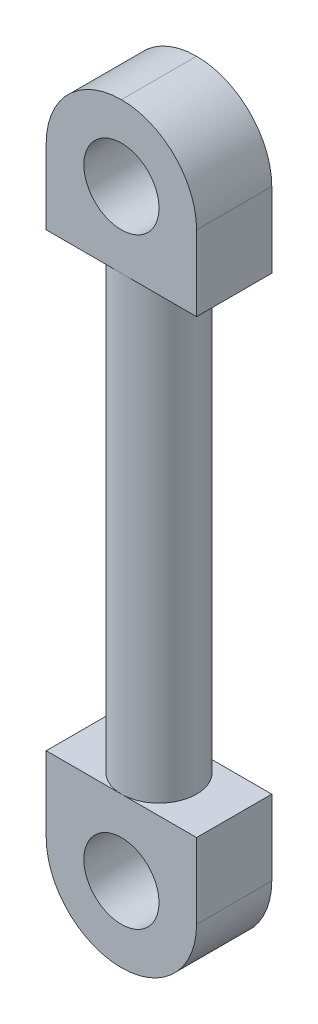
ISO-10303-21;
HEADER;
FILE_DESCRIPTION(('STEP AP214'),'2;1');
FILE_NAME('part.step','',(''),(''),'','','');
FILE_SCHEMA(('AUTOMOTIVE_DESIGN { 1 0 10303 214 1 1 1 1 }'));
ENDSEC;
DATA;
#1=APPLICATION_CONTEXT('core data for automotive mechanical design processes');
#2=APPLICATION_PROTOCOL_DEFINITION('international standard','automotive_design',2000,#1);
#3=PRODUCT_CONTEXT('',#1,'mechanical');
#4=PRODUCT('Part','Part','',(#3));
#5=PRODUCT_RELATED_PRODUCT_CATEGORY('part','',(#4));
#6=PRODUCT_DEFINITION_FORMATION('','',#4);
#7=PRODUCT_DEFINITION_CONTEXT('part definition',#1,'design');
#8=PRODUCT_DEFINITION('design','',#6,#7);
#9=PRODUCT_DEFINITION_SHAPE('','',#8);
#10=(LENGTH_UNIT() NAMED_UNIT(*) SI_UNIT(.MILLI.,.METRE.));
#11=(NAMED_UNIT(*) PLANE_ANGLE_UNIT() SI_UNIT($,.RADIAN.));
#12=(NAMED_UNIT(*) SI_UNIT($,.STERADIAN.) SOLID_ANGLE_UNIT());
#13=UNCERTAINTY_MEASURE_WITH_UNIT(LENGTH_MEASURE(1.E-05),#10,'distance_accuracy_value','');
#14=(GEOMETRIC_REPRESENTATION_CONTEXT(3) GLOBAL_UNCERTAINTY_ASSIGNED_CONTEXT((#13)) GLOBAL_UNIT_ASSIGNED_CONTEXT((#10,
#11,#12)) REPRESENTATION_CONTEXT('',''));
#15=CARTESIAN_POINT('',(0.,0.,0.));
#16=DIRECTION('',(0.,0.,1.));
#17=DIRECTION('',(1.,0.,0.));
#18=AXIS2_PLACEMENT_3D('',#15,#16,#17);
#19=CARTESIAN_POINT('',(0.,9.525,0.));
#20=DIRECTION('',(0.,-1.,0.));
#21=DIRECTION('',(0.,0.,-1.));
#22=AXIS2_PLACEMENT_3D('',#19,#20,#21);
#23=CYLINDRICAL_SURFACE('',#22,1.5875);
#24=CARTESIAN_POINT('',(0.,9.525,0.));
#25=DIRECTION('',(0.,1.,0.));
#26=DIRECTION('',(0.,0.,1.));
#27=AXIS2_PLACEMENT_3D('',#24,#25,#26);
#28=CIRCLE('',#27,1.5875);
#29=CARTESIAN_POINT('',(0.,9.525,1.5875));
#30=VERTEX_POINT('',#29);
#31=CARTESIAN_POINT('',(0.,9.525,-1.5875));
#32=VERTEX_POINT('',#31);
#33=EDGE_CURVE('E196',#30,#32,#28,.T.);
#34=ORIENTED_EDGE('',*,*,#33,.F.);
#35=EDGE_CURVE('E195',#32,#30,#28,.T.);
#36=ORIENTED_EDGE('',*,*,#35,.F.);
#37=EDGE_LOOP('',(#34,#36));
#38=FACE_BOUND('',#37,.T.);
#39=CARTESIAN_POINT('',(0.,-9.525,0.));
#40=DIRECTION('',(0.,1.,0.));
#41=DIRECTION('',(0.,0.,1.));
#42=AXIS2_PLACEMENT_3D('',#39,#40,#41);
#43=CIRCLE('',#42,1.5875);
#44=CARTESIAN_POINT('',(0.,-9.525,1.5875));
#45=VERTEX_POINT('',#44);
#46=CARTESIAN_POINT('',(0.,-9.525,-1.5875));
#47=VERTEX_POINT('',#46);
#48=EDGE_CURVE('E142',#45,#47,#43,.T.);
#49=ORIENTED_EDGE('',*,*,#48,.T.);
#50=EDGE_CURVE('E132',#47,#45,#43,.T.);
#51=ORIENTED_EDGE('',*,*,#50,.T.);
#52=EDGE_LOOP('',(#49,#51));
#53=FACE_BOUND('',#52,.T.);
#54=ADVANCED_FACE('F33',(#38,#53),#23,.T.);
#55=CARTESIAN_POINT('',(0.,9.525,0.));
#56=DIRECTION('',(0.,-1.,0.));
#57=DIRECTION('',(0.,0.,-1.));
#58=AXIS2_PLACEMENT_3D('',#55,#56,#57);
#59=PLANE('',#58);
#60=DIRECTION('',(1.,0.,0.));
#61=VECTOR('',#60,1.);
#62=CARTESIAN_POINT('',(-3.175,9.525,1.5875));
#63=LINE('',#62,#61);
#64=CARTESIAN_POINT('',(3.175,9.525,1.5875));
#65=VERTEX_POINT('',#64);
#66=EDGE_CURVE('E183',#30,#65,#63,.T.);
#67=ORIENTED_EDGE('',*,*,#66,.F.);
#68=ORIENTED_EDGE('',*,*,#33,.T.);
#69=DIRECTION('',(-1.,0.,0.));
#70=VECTOR('',#69,1.);
#71=CARTESIAN_POINT('',(-3.175,9.525,-1.5875));
#72=LINE('',#71,#70);
#73=CARTESIAN_POINT('',(3.175,9.525,-1.5875));
#74=VERTEX_POINT('',#73);
#75=EDGE_CURVE('E177',#74,#32,#72,.T.);
#76=ORIENTED_EDGE('',*,*,#75,.F.);
#77=DIRECTION('',(0.,0.,-1.));
#78=VECTOR('',#77,1.);
#79=CARTESIAN_POINT('',(3.175,9.525,1.5875));
#80=LINE('',#79,#78);
#81=EDGE_CURVE('E171',#65,#74,#80,.T.);
#82=ORIENTED_EDGE('',*,*,#81,.F.);
#83=EDGE_LOOP('',(#67,#68,#76,#82));
#84=FACE_BOUND('',#83,.T.);
#85=ADVANCED_FACE('F245',(#84),#59,.T.);
#86=CARTESIAN_POINT('',(3.175,15.875,1.5875));
#87=DIRECTION('',(-1.,0.,0.));
#88=DIRECTION('',(0.,0.,1.));
#89=AXIS2_PLACEMENT_3D('',#86,#87,#88);
#90=PLANE('',#89);
#91=DIRECTION('',(0.,-1.,0.));
#92=VECTOR('',#91,1.);
#93=CARTESIAN_POINT('',(3.175,15.875,-1.5875));
#94=LINE('',#93,#92);
#95=CARTESIAN_POINT('',(3.175,12.7,-1.5875));
#96=VERTEX_POINT('',#95);
#97=EDGE_CURVE('E193',#96,#74,#94,.T.);
#98=ORIENTED_EDGE('',*,*,#97,.F.);
#99=DIRECTION('',(0.,0.,-1.));
#100=VECTOR('',#99,1.);
#101=CARTESIAN_POINT('',(3.175,12.7,1.5875));
#102=LINE('',#101,#100);
#103=CARTESIAN_POINT('',(3.175,12.7,1.5875));
#104=VERTEX_POINT('',#103);
#105=EDGE_CURVE('E11',#96,#104,#102,.F.);
#106=ORIENTED_EDGE('',*,*,#105,.T.);
#107=DIRECTION('',(0.,-1.,0.));
#108=VECTOR('',#107,1.);
#109=CARTESIAN_POINT('',(3.175,15.875,1.5875));
#110=LINE('',#109,#108);
#111=EDGE_CURVE('E187',#104,#65,#110,.T.);
#112=ORIENTED_EDGE('',*,*,#111,.T.);
#113=ORIENTED_EDGE('',*,*,#81,.T.);
#114=EDGE_LOOP('',(#98,#106,#112,#113));
#115=FACE_BOUND('',#114,.T.);
#116=ADVANCED_FACE('F236',(#115),#90,.F.);
#117=CARTESIAN_POINT('',(-3.175,15.875,-1.5875));
#118=DIRECTION('',(0.,0.,1.));
#119=DIRECTION('',(1.,0.,0.));
#120=AXIS2_PLACEMENT_3D('',#117,#118,#119);
#121=PLANE('',#120);
#122=CARTESIAN_POINT('',(0.,12.7,-1.5875));
#123=DIRECTION('',(0.,0.,-1.));
#124=DIRECTION('',(-1.,0.,0.));
#125=AXIS2_PLACEMENT_3D('',#122,#123,#124);
#126=CIRCLE('',#125,1.5875);
#127=CARTESIAN_POINT('',(-1.5875,12.7,-1.5875));
#128=VERTEX_POINT('',#127);
#129=EDGE_CURVE('E167',#128,#128,#126,.T.);
#130=ORIENTED_EDGE('',*,*,#129,.F.);
#131=EDGE_LOOP('',(#130));
#132=FACE_BOUND('',#131,.T.);
#133=DIRECTION('',(0.,-1.,0.));
#134=VECTOR('',#133,1.);
#135=CARTESIAN_POINT('',(-3.175,15.875,-1.5875));
#136=LINE('',#135,#134);
#137=CARTESIAN_POINT('',(-3.175,12.7,-1.5875));
#138=VERTEX_POINT('',#137);
#139=CARTESIAN_POINT('',(-3.175,9.525,-1.5875));
#140=VERTEX_POINT('',#139);
#141=EDGE_CURVE('E191',#138,#140,#136,.T.);
#142=ORIENTED_EDGE('',*,*,#141,.F.);
#143=CARTESIAN_POINT('',(0.,12.7,-1.5875));
#144=DIRECTION('',(0.,0.,1.));
#145=DIRECTION('',(1.,0.,0.));
#146=AXIS2_PLACEMENT_3D('',#143,#144,#145);
#147=CIRCLE('',#146,3.175);
#148=CARTESIAN_POINT('',(0.,15.875,-1.5875));
#149=VERTEX_POINT('',#148);
#150=EDGE_CURVE('E42',#138,#149,#147,.F.);
#151=ORIENTED_EDGE('',*,*,#150,.T.);
#152=CARTESIAN_POINT('',(0.,12.7,-1.5875));
#153=DIRECTION('',(0.,0.,1.));
#154=DIRECTION('',(1.,0.,0.));
#155=AXIS2_PLACEMENT_3D('',#152,#153,#154);
#156=CIRCLE('',#155,3.175);
#157=EDGE_CURVE('E50',#149,#96,#156,.F.);
#158=ORIENTED_EDGE('',*,*,#157,.T.);
#159=ORIENTED_EDGE('',*,*,#97,.T.);
#160=ORIENTED_EDGE('',*,*,#75,.T.);
#161=EDGE_CURVE('E176',#32,#140,#72,.T.);
#162=ORIENTED_EDGE('',*,*,#161,.T.);
#163=EDGE_LOOP('',(#142,#151,#158,#159,#160,#162));
#164=FACE_BOUND('',#163,.T.);
#165=ADVANCED_FACE('F248',(#132,#164),#121,.F.);
#166=CARTESIAN_POINT('',(-3.175,15.875,1.5875));
#167=DIRECTION('',(1.,0.,0.));
#168=DIRECTION('',(0.,0.,-1.));
#169=AXIS2_PLACEMENT_3D('',#166,#167,#168);
#170=PLANE('',#169);
#171=DIRECTION('',(0.,-1.,0.));
#172=VECTOR('',#171,1.);
#173=CARTESIAN_POINT('',(-3.175,15.875,1.5875));
#174=LINE('',#173,#172);
#175=CARTESIAN_POINT('',(-3.175,12.7,1.5875));
#176=VERTEX_POINT('',#175);
#177=CARTESIAN_POINT('',(-3.175,9.525,1.5875));
#178=VERTEX_POINT('',#177);
#179=EDGE_CURVE('E189',#176,#178,#174,.T.);
#180=ORIENTED_EDGE('',*,*,#179,.F.);
#181=DIRECTION('',(0.,0.,1.));
#182=VECTOR('',#181,1.);
#183=CARTESIAN_POINT('',(-3.175,12.7,1.5875));
#184=LINE('',#183,#182);
#185=EDGE_CURVE('E215',#176,#138,#184,.F.);
#186=ORIENTED_EDGE('',*,*,#185,.T.);
#187=ORIENTED_EDGE('',*,*,#141,.T.);
#188=DIRECTION('',(0.,0.,1.));
#189=VECTOR('',#188,1.);
#190=CARTESIAN_POINT('',(-3.175,9.525,1.5875));
#191=LINE('',#190,#189);
#192=EDGE_CURVE('E180',#140,#178,#191,.T.);
#193=ORIENTED_EDGE('',*,*,#192,.T.);
#194=EDGE_LOOP('',(#180,#186,#187,#193));
#195=FACE_BOUND('',#194,.T.);
#196=ADVANCED_FACE('F255',(#195),#170,.F.);
#197=CARTESIAN_POINT('',(-3.175,15.875,1.5875));
#198=DIRECTION('',(0.,0.,-1.));
#199=DIRECTION('',(-1.,0.,0.));
#200=AXIS2_PLACEMENT_3D('',#197,#198,#199);
#201=PLANE('',#200);
#202=CARTESIAN_POINT('',(0.,12.7,1.5875));
#203=DIRECTION('',(0.,0.,-1.));
#204=DIRECTION('',(-1.,0.,0.));
#205=AXIS2_PLACEMENT_3D('',#202,#203,#204);
#206=CIRCLE('',#205,1.5875);
#207=CARTESIAN_POINT('',(-1.5875,12.7,1.5875));
#208=VERTEX_POINT('',#207);
#209=EDGE_CURVE('E168',#208,#208,#206,.T.);
#210=ORIENTED_EDGE('',*,*,#209,.T.);
#211=EDGE_LOOP('',(#210));
#212=FACE_BOUND('',#211,.T.);
#213=CARTESIAN_POINT('',(0.,12.7,1.5875));
#214=DIRECTION('',(0.,0.,-1.));
#215=DIRECTION('',(-1.,0.,0.));
#216=AXIS2_PLACEMENT_3D('',#213,#214,#215);
#217=CIRCLE('',#216,3.175);
#218=CARTESIAN_POINT('',(0.,15.875,1.5875));
#219=VERTEX_POINT('',#218);
#220=EDGE_CURVE('E211',#104,#219,#217,.F.);
#221=ORIENTED_EDGE('',*,*,#220,.T.);
#222=CARTESIAN_POINT('',(0.,12.7,1.5875));
#223=DIRECTION('',(0.,0.,-1.));
#224=DIRECTION('',(-1.,0.,0.));
#225=AXIS2_PLACEMENT_3D('',#222,#223,#224);
#226=CIRCLE('',#225,3.175);
#227=EDGE_CURVE('E213',#219,#176,#226,.F.);
#228=ORIENTED_EDGE('',*,*,#227,.T.);
#229=ORIENTED_EDGE('',*,*,#179,.T.);
#230=EDGE_CURVE('E184',#178,#30,#63,.T.);
#231=ORIENTED_EDGE('',*,*,#230,.T.);
#232=ORIENTED_EDGE('',*,*,#66,.T.);
#233=ORIENTED_EDGE('',*,*,#111,.F.);
#234=EDGE_LOOP('',(#221,#228,#229,#231,#232,#233));
#235=FACE_BOUND('',#234,.T.);
#236=ADVANCED_FACE('F239',(#212,#235),#201,.F.);
#237=ORIENTED_EDGE('',*,*,#161,.F.);
#238=ORIENTED_EDGE('',*,*,#35,.T.);
#239=ORIENTED_EDGE('',*,*,#230,.F.);
#240=ORIENTED_EDGE('',*,*,#192,.F.);
#241=EDGE_LOOP('',(#237,#238,#239,#240));
#242=FACE_BOUND('',#241,.T.);
#243=ADVANCED_FACE('F252',(#242),#59,.T.);
#244=CARTESIAN_POINT('',(0.,12.7,1.5875));
#245=DIRECTION('',(0.,0.,-1.));
#246=DIRECTION('',(-1.,0.,0.));
#247=AXIS2_PLACEMENT_3D('',#244,#245,#246);
#248=CYLINDRICAL_SURFACE('',#247,1.5875);
#249=ORIENTED_EDGE('',*,*,#209,.F.);
#250=EDGE_LOOP('',(#249));
#251=FACE_BOUND('',#250,.T.);
#252=ORIENTED_EDGE('',*,*,#129,.T.);
#253=EDGE_LOOP('',(#252));
#254=FACE_BOUND('',#253,.T.);
#255=ADVANCED_FACE('F349',(#251,#254),#248,.F.);
#256=CARTESIAN_POINT('',(0.,-9.525,0.));
#257=DIRECTION('',(0.,1.,0.));
#258=DIRECTION('',(0.,0.,-1.));
#259=AXIS2_PLACEMENT_3D('',#256,#257,#258);
#260=PLANE('',#259);
#261=ORIENTED_EDGE('',*,*,#48,.F.);
#262=DIRECTION('',(1.,0.,0.));
#263=VECTOR('',#262,1.);
#264=CARTESIAN_POINT('',(-3.175,-9.525,1.5875));
#265=LINE('',#264,#263);
#266=CARTESIAN_POINT('',(3.175,-9.525,1.5875));
#267=VERTEX_POINT('',#266);
#268=EDGE_CURVE('E125',#45,#267,#265,.T.);
#269=ORIENTED_EDGE('',*,*,#268,.T.);
#270=DIRECTION('',(0.,0.,-1.));
#271=VECTOR('',#270,1.);
#272=CARTESIAN_POINT('',(3.175,-9.525,1.5875));
#273=LINE('',#272,#271);
#274=CARTESIAN_POINT('',(3.175,-9.525,-1.5875));
#275=VERTEX_POINT('',#274);
#276=EDGE_CURVE('E139',#267,#275,#273,.T.);
#277=ORIENTED_EDGE('',*,*,#276,.T.);
#278=DIRECTION('',(-1.,0.,0.));
#279=VECTOR('',#278,1.);
#280=CARTESIAN_POINT('',(-3.175,-9.525,-1.5875));
#281=LINE('',#280,#279);
#282=EDGE_CURVE('E160',#275,#47,#281,.T.);
#283=ORIENTED_EDGE('',*,*,#282,.T.);
#284=EDGE_LOOP('',(#261,#269,#277,#283));
#285=FACE_BOUND('',#284,.T.);
#286=ADVANCED_FACE('F137',(#285),#260,.T.);
#287=ORIENTED_EDGE('',*,*,#50,.F.);
#288=CARTESIAN_POINT('',(-3.175,-9.525,-1.5875));
#289=VERTEX_POINT('',#288);
#290=EDGE_CURVE('E159',#47,#289,#281,.T.);
#291=ORIENTED_EDGE('',*,*,#290,.T.);
#292=DIRECTION('',(0.,0.,1.));
#293=VECTOR('',#292,1.);
#294=CARTESIAN_POINT('',(-3.175,-9.525,1.5875));
#295=LINE('',#294,#293);
#296=CARTESIAN_POINT('',(-3.175,-9.525,1.5875));
#297=VERTEX_POINT('',#296);
#298=EDGE_CURVE('E156',#289,#297,#295,.T.);
#299=ORIENTED_EDGE('',*,*,#298,.T.);
#300=EDGE_CURVE('E144',#297,#45,#265,.T.);
#301=ORIENTED_EDGE('',*,*,#300,.T.);
#302=EDGE_LOOP('',(#287,#291,#299,#301));
#303=FACE_BOUND('',#302,.T.);
#304=ADVANCED_FACE('F335',(#303),#260,.T.);
#305=CARTESIAN_POINT('',(3.175,-15.875,1.5875));
#306=DIRECTION('',(1.,0.,0.));
#307=DIRECTION('',(0.,0.,-1.));
#308=AXIS2_PLACEMENT_3D('',#305,#306,#307);
#309=PLANE('',#308);
#310=DIRECTION('',(0.,1.,0.));
#311=VECTOR('',#310,1.);
#312=CARTESIAN_POINT('',(3.175,-15.875,1.5875));
#313=LINE('',#312,#311);
#314=CARTESIAN_POINT('',(3.175,-12.7,1.5875));
#315=VERTEX_POINT('',#314);
#316=EDGE_CURVE('E120',#315,#267,#313,.T.);
#317=ORIENTED_EDGE('',*,*,#316,.F.);
#318=DIRECTION('',(0.,0.,-1.));
#319=VECTOR('',#318,1.);
#320=CARTESIAN_POINT('',(3.175,-12.7,-1.5875));
#321=LINE('',#320,#319);
#322=CARTESIAN_POINT('',(3.175,-12.7,-1.5875));
#323=VERTEX_POINT('',#322);
#324=EDGE_CURVE('E209',#315,#323,#321,.T.);
#325=ORIENTED_EDGE('',*,*,#324,.T.);
#326=DIRECTION('',(0.,1.,0.));
#327=VECTOR('',#326,1.);
#328=CARTESIAN_POINT('',(3.175,-15.875,-1.5875));
#329=LINE('',#328,#327);
#330=EDGE_CURVE('E148',#323,#275,#329,.T.);
#331=ORIENTED_EDGE('',*,*,#330,.T.);
#332=ORIENTED_EDGE('',*,*,#276,.F.);
#333=EDGE_LOOP('',(#317,#325,#331,#332));
#334=FACE_BOUND('',#333,.T.);
#335=ADVANCED_FACE('F146',(#334),#309,.T.);
#336=CARTESIAN_POINT('',(-3.175,-15.875,1.5875));
#337=DIRECTION('',(0.,0.,1.));
#338=DIRECTION('',(1.,0.,0.));
#339=AXIS2_PLACEMENT_3D('',#336,#337,#338);
#340=PLANE('',#339);
#341=CARTESIAN_POINT('',(0.,-12.7,1.5875));
#342=DIRECTION('',(0.,0.,1.));
#343=DIRECTION('',(-1.,0.,0.));
#344=AXIS2_PLACEMENT_3D('',#341,#342,#343);
#345=CIRCLE('',#344,1.5875);
#346=CARTESIAN_POINT('',(-1.5875,-12.7,1.5875));
#347=VERTEX_POINT('',#346);
#348=EDGE_CURVE('E149',#347,#347,#345,.T.);
#349=ORIENTED_EDGE('',*,*,#348,.F.);
#350=EDGE_LOOP('',(#349));
#351=FACE_BOUND('',#350,.T.);
#352=DIRECTION('',(0.,1.,0.));
#353=VECTOR('',#352,1.);
#354=CARTESIAN_POINT('',(-3.175,-15.875,1.5875));
#355=LINE('',#354,#353);
#356=CARTESIAN_POINT('',(-3.175,-12.7,1.5875));
#357=VERTEX_POINT('',#356);
#358=EDGE_CURVE('E133',#357,#297,#355,.T.);
#359=ORIENTED_EDGE('',*,*,#358,.F.);
#360=CARTESIAN_POINT('',(0.,-12.7,1.5875));
#361=DIRECTION('',(0.,0.,1.));
#362=DIRECTION('',(1.,0.,0.));
#363=AXIS2_PLACEMENT_3D('',#360,#361,#362);
#364=CIRCLE('',#363,3.175);
#365=CARTESIAN_POINT('',(0.,-15.875,1.5875));
#366=VERTEX_POINT('',#365);
#367=EDGE_CURVE('E203',#357,#366,#364,.T.);
#368=ORIENTED_EDGE('',*,*,#367,.T.);
#369=CARTESIAN_POINT('',(0.,-12.7,1.5875));
#370=DIRECTION('',(0.,0.,1.));
#371=DIRECTION('',(1.,0.,0.));
#372=AXIS2_PLACEMENT_3D('',#369,#370,#371);
#373=CIRCLE('',#372,3.175);
#374=EDGE_CURVE('E128',#366,#315,#373,.T.);
#375=ORIENTED_EDGE('',*,*,#374,.T.);
#376=ORIENTED_EDGE('',*,*,#316,.T.);
#377=ORIENTED_EDGE('',*,*,#268,.F.);
#378=ORIENTED_EDGE('',*,*,#300,.F.);
#379=EDGE_LOOP('',(#359,#368,#375,#376,#377,#378));
#380=FACE_BOUND('',#379,.T.);
#381=ADVANCED_FACE('F123',(#351,#380),#340,.T.);
#382=CARTESIAN_POINT('',(-3.175,-15.875,1.5875));
#383=DIRECTION('',(-1.,0.,0.));
#384=DIRECTION('',(0.,0.,1.));
#385=AXIS2_PLACEMENT_3D('',#382,#383,#384);
#386=PLANE('',#385);
#387=DIRECTION('',(0.,1.,0.));
#388=VECTOR('',#387,1.);
#389=CARTESIAN_POINT('',(-3.175,-15.875,-1.5875));
#390=LINE('',#389,#388);
#391=CARTESIAN_POINT('',(-3.175,-12.7,-1.5875));
#392=VERTEX_POINT('',#391);
#393=EDGE_CURVE('E163',#392,#289,#390,.T.);
#394=ORIENTED_EDGE('',*,*,#393,.F.);
#395=DIRECTION('',(0.,0.,1.));
#396=VECTOR('',#395,1.);
#397=CARTESIAN_POINT('',(-3.175,-12.7,1.5875));
#398=LINE('',#397,#396);
#399=EDGE_CURVE('E199',#392,#357,#398,.T.);
#400=ORIENTED_EDGE('',*,*,#399,.T.);
#401=ORIENTED_EDGE('',*,*,#358,.T.);
#402=ORIENTED_EDGE('',*,*,#298,.F.);
#403=EDGE_LOOP('',(#394,#400,#401,#402));
#404=FACE_BOUND('',#403,.T.);
#405=ADVANCED_FACE('F313',(#404),#386,.T.);
#406=CARTESIAN_POINT('',(-3.175,-15.875,-1.5875));
#407=DIRECTION('',(0.,0.,-1.));
#408=DIRECTION('',(-1.,0.,0.));
#409=AXIS2_PLACEMENT_3D('',#406,#407,#408);
#410=PLANE('',#409);
#411=CARTESIAN_POINT('',(0.,-12.7,-1.5875));
#412=DIRECTION('',(0.,0.,1.));
#413=DIRECTION('',(-1.,0.,0.));
#414=AXIS2_PLACEMENT_3D('',#411,#412,#413);
#415=CIRCLE('',#414,1.5875);
#416=CARTESIAN_POINT('',(-1.5875,-12.7,-1.5875));
#417=VERTEX_POINT('',#416);
#418=EDGE_CURVE('E152',#417,#417,#415,.T.);
#419=ORIENTED_EDGE('',*,*,#418,.T.);
#420=EDGE_LOOP('',(#419));
#421=FACE_BOUND('',#420,.T.);
#422=CARTESIAN_POINT('',(0.,-12.7,-1.5875));
#423=DIRECTION('',(0.,0.,-1.));
#424=DIRECTION('',(-1.,0.,0.));
#425=AXIS2_PLACEMENT_3D('',#422,#423,#424);
#426=CIRCLE('',#425,3.175);
#427=CARTESIAN_POINT('',(0.,-15.875,-1.5875));
#428=VERTEX_POINT('',#427);
#429=EDGE_CURVE('E205',#323,#428,#426,.T.);
#430=ORIENTED_EDGE('',*,*,#429,.T.);
#431=CARTESIAN_POINT('',(0.,-12.7,-1.5875));
#432=DIRECTION('',(0.,0.,-1.));
#433=DIRECTION('',(-1.,0.,0.));
#434=AXIS2_PLACEMENT_3D('',#431,#432,#433);
#435=CIRCLE('',#434,3.175);
#436=EDGE_CURVE('E207',#428,#392,#435,.T.);
#437=ORIENTED_EDGE('',*,*,#436,.T.);
#438=ORIENTED_EDGE('',*,*,#393,.T.);
#439=ORIENTED_EDGE('',*,*,#290,.F.);
#440=ORIENTED_EDGE('',*,*,#282,.F.);
#441=ORIENTED_EDGE('',*,*,#330,.F.);
#442=EDGE_LOOP('',(#430,#437,#438,#439,#440,#441));
#443=FACE_BOUND('',#442,.T.);
#444=ADVANCED_FACE('F304',(#421,#443),#410,.T.);
#445=CARTESIAN_POINT('',(0.,-12.7,1.5875));
#446=DIRECTION('',(0.,0.,-1.));
#447=DIRECTION('',(-1.,0.,0.));
#448=AXIS2_PLACEMENT_3D('',#445,#446,#447);
#449=CYLINDRICAL_SURFACE('',#448,1.5875);
#450=ORIENTED_EDGE('',*,*,#348,.T.);
#451=EDGE_LOOP('',(#450));
#452=FACE_BOUND('',#451,.T.);
#453=ORIENTED_EDGE('',*,*,#418,.F.);
#454=EDGE_LOOP('',(#453));
#455=FACE_BOUND('',#454,.T.);
#456=ADVANCED_FACE('F281',(#452,#455),#449,.F.);
#457=CARTESIAN_POINT('',(0.,-12.7,1.5875));
#458=DIRECTION('',(0.,0.,1.));
#459=DIRECTION('',(1.,0.,0.));
#460=AXIS2_PLACEMENT_3D('',#457,#458,#459);
#461=CYLINDRICAL_SURFACE('',#460,3.175);
#462=DIRECTION('',(0.,0.,-1.));
#463=VECTOR('',#462,1.);
#464=CARTESIAN_POINT('',(0.,-15.875,1.5875));
#465=LINE('',#464,#463);
#466=EDGE_CURVE('E219',#428,#366,#465,.F.);
#467=ORIENTED_EDGE('',*,*,#466,.F.);
#468=ORIENTED_EDGE('',*,*,#429,.F.);
#469=ORIENTED_EDGE('',*,*,#324,.F.);
#470=ORIENTED_EDGE('',*,*,#374,.F.);
#471=EDGE_LOOP('',(#467,#468,#469,#470));
#472=FACE_BOUND('',#471,.T.);
#473=ADVANCED_FACE('F279',(#472),#461,.T.);
#474=CARTESIAN_POINT('',(0.,-12.7,1.5875));
#475=DIRECTION('',(0.,0.,-1.));
#476=DIRECTION('',(-1.,0.,0.));
#477=AXIS2_PLACEMENT_3D('',#474,#475,#476);
#478=CYLINDRICAL_SURFACE('',#477,3.175);
#479=ORIENTED_EDGE('',*,*,#436,.F.);
#480=ORIENTED_EDGE('',*,*,#466,.T.);
#481=ORIENTED_EDGE('',*,*,#367,.F.);
#482=ORIENTED_EDGE('',*,*,#399,.F.);
#483=EDGE_LOOP('',(#479,#480,#481,#482));
#484=FACE_BOUND('',#483,.T.);
#485=ADVANCED_FACE('F276',(#484),#478,.T.);
#486=CARTESIAN_POINT('',(0.,12.7,0.));
#487=DIRECTION('',(0.,0.,-1.));
#488=DIRECTION('',(-1.,0.,0.));
#489=AXIS2_PLACEMENT_3D('',#486,#487,#488);
#490=CYLINDRICAL_SURFACE('',#489,3.175);
#491=ORIENTED_EDGE('',*,*,#105,.F.);
#492=ORIENTED_EDGE('',*,*,#157,.F.);
#493=DIRECTION('',(0.,0.,-1.));
#494=VECTOR('',#493,1.);
#495=CARTESIAN_POINT('',(0.,15.875,0.));
#496=LINE('',#495,#494);
#497=EDGE_CURVE('E37',#219,#149,#496,.T.);
#498=ORIENTED_EDGE('',*,*,#497,.F.);
#499=ORIENTED_EDGE('',*,*,#220,.F.);
#500=EDGE_LOOP('',(#491,#492,#498,#499));
#501=FACE_BOUND('',#500,.T.);
#502=ADVANCED_FACE('F35',(#501),#490,.T.);
#503=CARTESIAN_POINT('',(0.,12.7,0.));
#504=DIRECTION('',(0.,0.,1.));
#505=DIRECTION('',(1.,0.,0.));
#506=AXIS2_PLACEMENT_3D('',#503,#504,#505);
#507=CYLINDRICAL_SURFACE('',#506,3.175);
#508=ORIENTED_EDGE('',*,*,#150,.F.);
#509=ORIENTED_EDGE('',*,*,#185,.F.);
#510=ORIENTED_EDGE('',*,*,#227,.F.);
#511=ORIENTED_EDGE('',*,*,#497,.T.);
#512=EDGE_LOOP('',(#508,#509,#510,#511));
#513=FACE_BOUND('',#512,.T.);
#514=ADVANCED_FACE('F229',(#513),#507,.T.);
#515=CLOSED_SHELL('',(#54,#85,#116,#165,#196,#236,#243,#255,#286,#304,#335,#381,#405,#444,#456,
#473,#485,#502,#514));
#516=MANIFOLD_SOLID_BREP('B2',#515);
#517=ADVANCED_BREP_SHAPE_REPRESENTATION('',(#18,#516),#14);
#518=SHAPE_DEFINITION_REPRESENTATION(#9,#517);
ENDSEC;
END-ISO-10303-21;
